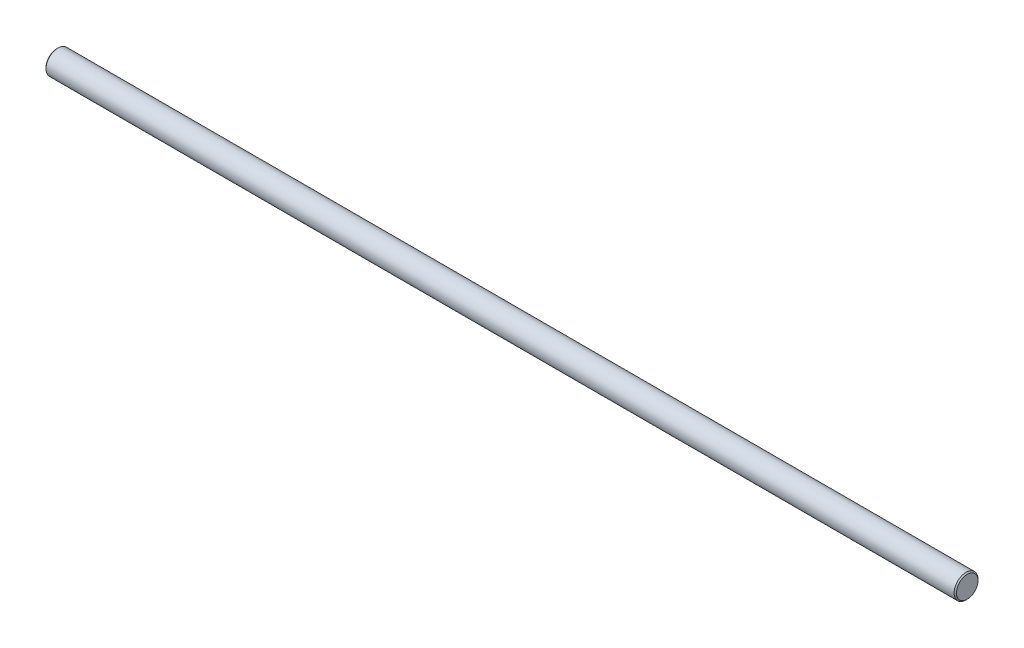
ISO-10303-21;
HEADER;
FILE_DESCRIPTION(('STEP AP214'),'2;1');
FILE_NAME('part.step','',(''),(''),'','','');
FILE_SCHEMA(('AUTOMOTIVE_DESIGN { 1 0 10303 214 1 1 1 1 }'));
ENDSEC;
DATA;
#1=APPLICATION_CONTEXT('core data for automotive mechanical design processes');
#2=APPLICATION_PROTOCOL_DEFINITION('international standard','automotive_design',2000,#1);
#3=PRODUCT_CONTEXT('',#1,'mechanical');
#4=PRODUCT('Part','Part','',(#3));
#5=PRODUCT_RELATED_PRODUCT_CATEGORY('part','',(#4));
#6=PRODUCT_DEFINITION_FORMATION('','',#4);
#7=PRODUCT_DEFINITION_CONTEXT('part definition',#1,'design');
#8=PRODUCT_DEFINITION('design','',#6,#7);
#9=PRODUCT_DEFINITION_SHAPE('','',#8);
#10=(LENGTH_UNIT() NAMED_UNIT(*) SI_UNIT(.MILLI.,.METRE.));
#11=(NAMED_UNIT(*) PLANE_ANGLE_UNIT() SI_UNIT($,.RADIAN.));
#12=(NAMED_UNIT(*) SI_UNIT($,.STERADIAN.) SOLID_ANGLE_UNIT());
#13=UNCERTAINTY_MEASURE_WITH_UNIT(LENGTH_MEASURE(1.E-05),#10,'distance_accuracy_value','');
#14=(GEOMETRIC_REPRESENTATION_CONTEXT(3) GLOBAL_UNCERTAINTY_ASSIGNED_CONTEXT((#13)) GLOBAL_UNIT_ASSIGNED_CONTEXT((#10,
#11,#12)) REPRESENTATION_CONTEXT('',''));
#15=CARTESIAN_POINT('',(0.,0.,0.));
#16=DIRECTION('',(0.,0.,1.));
#17=DIRECTION('',(1.,0.,0.));
#18=AXIS2_PLACEMENT_3D('',#15,#16,#17);
#19=CARTESIAN_POINT('',(0.,0.,0.));
#20=DIRECTION('',(1.,0.,0.));
#21=DIRECTION('',(0.,0.,-1.));
#22=AXIS2_PLACEMENT_3D('',#19,#20,#21);
#23=PLANE('',#22);
#24=CARTESIAN_POINT('',(0.,0.,0.));
#25=DIRECTION('',(-1.,0.,0.));
#26=DIRECTION('',(0.,0.,1.));
#27=AXIS2_PLACEMENT_3D('',#24,#25,#26);
#28=CIRCLE('',#27,4.5);
#29=CARTESIAN_POINT('',(0.,0.,4.5));
#30=VERTEX_POINT('',#29);
#31=EDGE_CURVE('E10',#30,#30,#28,.T.);
#32=ORIENTED_EDGE('',*,*,#31,.T.);
#33=EDGE_LOOP('',(#32));
#34=FACE_BOUND('',#33,.T.);
#35=ADVANCED_FACE('F31',(#34),#23,.F.);
#36=CARTESIAN_POINT('',(0.5,0.,0.));
#37=DIRECTION('',(1.,0.,0.));
#38=DIRECTION('',(0.,0.,-1.));
#39=AXIS2_PLACEMENT_3D('',#36,#37,#38);
#40=CONICAL_SURFACE('',#39,5.,0.785398163397448);
#41=ORIENTED_EDGE('',*,*,#31,.F.);
#42=EDGE_LOOP('',(#41));
#43=FACE_BOUND('',#42,.T.);
#44=CARTESIAN_POINT('',(0.5,0.,0.));
#45=DIRECTION('',(-1.,0.,0.));
#46=DIRECTION('',(0.,0.,1.));
#47=AXIS2_PLACEMENT_3D('',#44,#45,#46);
#48=CIRCLE('',#47,5.);
#49=CARTESIAN_POINT('',(0.5,0.,5.));
#50=VERTEX_POINT('',#49);
#51=EDGE_CURVE('E37',#50,#50,#48,.T.);
#52=ORIENTED_EDGE('',*,*,#51,.T.);
#53=EDGE_LOOP('',(#52));
#54=FACE_BOUND('',#53,.T.);
#55=ADVANCED_FACE('F63',(#43,#54),#40,.T.);
#56=CARTESIAN_POINT('',(380.,0.,0.));
#57=DIRECTION('',(-1.,0.,0.));
#58=DIRECTION('',(0.,0.,1.));
#59=AXIS2_PLACEMENT_3D('',#56,#57,#58);
#60=CYLINDRICAL_SURFACE('',#59,5.);
#61=ORIENTED_EDGE('',*,*,#51,.F.);
#62=EDGE_LOOP('',(#61));
#63=FACE_BOUND('',#62,.T.);
#64=CARTESIAN_POINT('',(379.5,0.,0.));
#65=DIRECTION('',(-1.,0.,0.));
#66=DIRECTION('',(0.,0.,1.));
#67=AXIS2_PLACEMENT_3D('',#64,#65,#66);
#68=CIRCLE('',#67,5.);
#69=CARTESIAN_POINT('',(379.5,0.,5.));
#70=VERTEX_POINT('',#69);
#71=EDGE_CURVE('E41',#70,#70,#68,.T.);
#72=ORIENTED_EDGE('',*,*,#71,.T.);
#73=EDGE_LOOP('',(#72));
#74=FACE_BOUND('',#73,.T.);
#75=ADVANCED_FACE('F59',(#63,#74),#60,.T.);
#76=CARTESIAN_POINT('',(380.,0.,0.));
#77=DIRECTION('',(-1.,0.,0.));
#78=DIRECTION('',(0.,0.,1.));
#79=AXIS2_PLACEMENT_3D('',#76,#77,#78);
#80=CONICAL_SURFACE('',#79,4.5,0.785398163397448);
#81=ORIENTED_EDGE('',*,*,#71,.F.);
#82=EDGE_LOOP('',(#81));
#83=FACE_BOUND('',#82,.T.);
#84=CARTESIAN_POINT('',(380.,0.,0.));
#85=DIRECTION('',(-1.,0.,0.));
#86=DIRECTION('',(0.,0.,1.));
#87=AXIS2_PLACEMENT_3D('',#84,#85,#86);
#88=CIRCLE('',#87,4.5);
#89=CARTESIAN_POINT('',(380.,0.,4.5));
#90=VERTEX_POINT('',#89);
#91=EDGE_CURVE('E45',#90,#90,#88,.T.);
#92=ORIENTED_EDGE('',*,*,#91,.T.);
#93=EDGE_LOOP('',(#92));
#94=FACE_BOUND('',#93,.T.);
#95=ADVANCED_FACE('F51',(#83,#94),#80,.T.);
#96=CARTESIAN_POINT('',(380.,4.5,0.));
#97=DIRECTION('',(-1.,0.,0.));
#98=DIRECTION('',(0.,0.,1.));
#99=AXIS2_PLACEMENT_3D('',#96,#97,#98);
#100=PLANE('',#99);
#101=ORIENTED_EDGE('',*,*,#91,.F.);
#102=EDGE_LOOP('',(#101));
#103=FACE_BOUND('',#102,.T.);
#104=ADVANCED_FACE('F53',(#103),#100,.F.);
#105=CLOSED_SHELL('',(#35,#55,#75,#95,#104));
#106=MANIFOLD_SOLID_BREP('B2',#105);
#107=ADVANCED_BREP_SHAPE_REPRESENTATION('',(#18,#106),#14);
#108=SHAPE_DEFINITION_REPRESENTATION(#9,#107);
ENDSEC;
END-ISO-10303-21;
